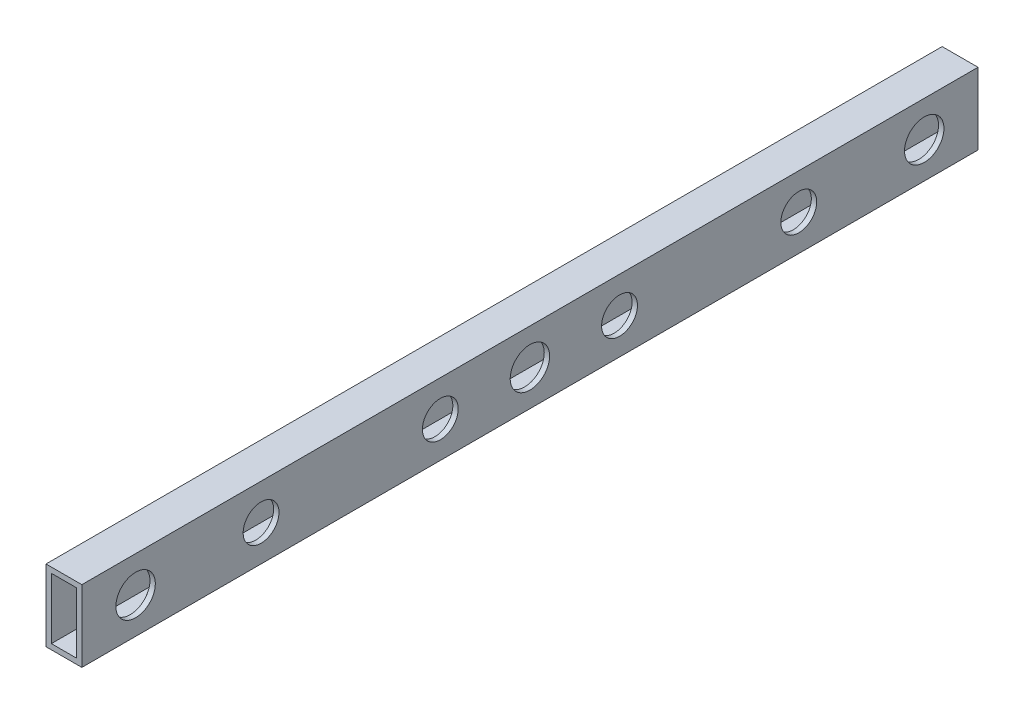
ISO-10303-21;
HEADER;
FILE_DESCRIPTION(('STEP AP214'),'2;1');
FILE_NAME('part.step','',(''),(''),'','','');
FILE_SCHEMA(('AUTOMOTIVE_DESIGN { 1 0 10303 214 1 1 1 1 }'));
ENDSEC;
DATA;
#1=APPLICATION_CONTEXT('core data for automotive mechanical design processes');
#2=APPLICATION_PROTOCOL_DEFINITION('international standard','automotive_design',2000,#1);
#3=PRODUCT_CONTEXT('',#1,'mechanical');
#4=PRODUCT('Part','Part','',(#3));
#5=PRODUCT_RELATED_PRODUCT_CATEGORY('part','',(#4));
#6=PRODUCT_DEFINITION_FORMATION('','',#4);
#7=PRODUCT_DEFINITION_CONTEXT('part definition',#1,'design');
#8=PRODUCT_DEFINITION('design','',#6,#7);
#9=PRODUCT_DEFINITION_SHAPE('','',#8);
#10=(LENGTH_UNIT() NAMED_UNIT(*) SI_UNIT(.MILLI.,.METRE.));
#11=(NAMED_UNIT(*) PLANE_ANGLE_UNIT() SI_UNIT($,.RADIAN.));
#12=(NAMED_UNIT(*) SI_UNIT($,.STERADIAN.) SOLID_ANGLE_UNIT());
#13=UNCERTAINTY_MEASURE_WITH_UNIT(LENGTH_MEASURE(1.E-05),#10,'distance_accuracy_value','');
#14=(GEOMETRIC_REPRESENTATION_CONTEXT(3) GLOBAL_UNCERTAINTY_ASSIGNED_CONTEXT((#13)) GLOBAL_UNIT_ASSIGNED_CONTEXT((#10,
#11,#12)) REPRESENTATION_CONTEXT('',''));
#15=CARTESIAN_POINT('',(0.,0.,0.));
#16=DIRECTION('',(0.,0.,1.));
#17=DIRECTION('',(1.,0.,0.));
#18=AXIS2_PLACEMENT_3D('',#15,#16,#17);
#19=CARTESIAN_POINT('',(0.,0.,250.));
#20=DIRECTION('',(0.,0.,1.));
#21=DIRECTION('',(1.,0.,0.));
#22=AXIS2_PLACEMENT_3D('',#19,#20,#21);
#23=PLANE('',#22);
#24=DIRECTION('',(0.,-1.,0.));
#25=VECTOR('',#24,1.);
#26=CARTESIAN_POINT('',(0.,0.,250.));
#27=LINE('',#26,#25);
#28=CARTESIAN_POINT('',(0.,20.,250.));
#29=VERTEX_POINT('',#28);
#30=CARTESIAN_POINT('',(0.,0.,250.));
#31=VERTEX_POINT('',#30);
#32=EDGE_CURVE('E163',#29,#31,#27,.T.);
#33=ORIENTED_EDGE('',*,*,#32,.T.);
#34=DIRECTION('',(1.,0.,0.));
#35=VECTOR('',#34,1.);
#36=CARTESIAN_POINT('',(0.,0.,250.));
#37=LINE('',#36,#35);
#38=CARTESIAN_POINT('',(10.,0.,250.));
#39=VERTEX_POINT('',#38);
#40=EDGE_CURVE('E166',#31,#39,#37,.T.);
#41=ORIENTED_EDGE('',*,*,#40,.T.);
#42=DIRECTION('',(0.,1.,0.));
#43=VECTOR('',#42,1.);
#44=CARTESIAN_POINT('',(10.,0.,250.));
#45=LINE('',#44,#43);
#46=CARTESIAN_POINT('',(10.,20.,250.));
#47=VERTEX_POINT('',#46);
#48=EDGE_CURVE('E169',#39,#47,#45,.T.);
#49=ORIENTED_EDGE('',*,*,#48,.T.);
#50=DIRECTION('',(-1.,0.,0.));
#51=VECTOR('',#50,1.);
#52=CARTESIAN_POINT('',(0.,20.,250.));
#53=LINE('',#52,#51);
#54=EDGE_CURVE('E171',#47,#29,#53,.T.);
#55=ORIENTED_EDGE('',*,*,#54,.T.);
#56=EDGE_LOOP('',(#33,#41,#49,#55));
#57=FACE_BOUND('',#56,.T.);
#58=DIRECTION('',(1.,0.,0.));
#59=VECTOR('',#58,1.);
#60=CARTESIAN_POINT('',(0.,1.5,250.));
#61=LINE('',#60,#59);
#62=CARTESIAN_POINT('',(1.5,1.5,250.));
#63=VERTEX_POINT('',#62);
#64=CARTESIAN_POINT('',(8.5,1.5,250.));
#65=VERTEX_POINT('',#64);
#66=EDGE_CURVE('E133',#63,#65,#61,.T.);
#67=ORIENTED_EDGE('',*,*,#66,.F.);
#68=DIRECTION('',(0.,-1.,0.));
#69=VECTOR('',#68,1.);
#70=CARTESIAN_POINT('',(1.5,20.,250.));
#71=LINE('',#70,#69);
#72=CARTESIAN_POINT('',(1.5,18.5,250.));
#73=VERTEX_POINT('',#72);
#74=EDGE_CURVE('E125',#73,#63,#71,.T.);
#75=ORIENTED_EDGE('',*,*,#74,.F.);
#76=DIRECTION('',(-1.,0.,0.));
#77=VECTOR('',#76,1.);
#78=CARTESIAN_POINT('',(0.,18.5,250.));
#79=LINE('',#78,#77);
#80=CARTESIAN_POINT('',(8.5,18.5,250.));
#81=VERTEX_POINT('',#80);
#82=EDGE_CURVE('E147',#81,#73,#79,.T.);
#83=ORIENTED_EDGE('',*,*,#82,.F.);
#84=DIRECTION('',(0.,1.,0.));
#85=VECTOR('',#84,1.);
#86=CARTESIAN_POINT('',(8.5,20.,250.));
#87=LINE('',#86,#85);
#88=EDGE_CURVE('E145',#65,#81,#87,.T.);
#89=ORIENTED_EDGE('',*,*,#88,.F.);
#90=EDGE_LOOP('',(#67,#75,#83,#89));
#91=FACE_BOUND('',#90,.T.);
#92=ADVANCED_FACE('F58',(#57,#91),#23,.T.);
#93=CARTESIAN_POINT('',(0.,0.,0.));
#94=DIRECTION('',(0.,0.,1.));
#95=DIRECTION('',(1.,0.,0.));
#96=AXIS2_PLACEMENT_3D('',#93,#94,#95);
#97=PLANE('',#96);
#98=DIRECTION('',(0.,-1.,0.));
#99=VECTOR('',#98,1.);
#100=CARTESIAN_POINT('',(0.,0.,0.));
#101=LINE('',#100,#99);
#102=CARTESIAN_POINT('',(0.,20.,0.));
#103=VERTEX_POINT('',#102);
#104=CARTESIAN_POINT('',(0.,0.,0.));
#105=VERTEX_POINT('',#104);
#106=EDGE_CURVE('E141',#103,#105,#101,.T.);
#107=ORIENTED_EDGE('',*,*,#106,.F.);
#108=DIRECTION('',(-1.,0.,0.));
#109=VECTOR('',#108,1.);
#110=CARTESIAN_POINT('',(0.,20.,0.));
#111=LINE('',#110,#109);
#112=CARTESIAN_POINT('',(10.,20.,0.));
#113=VERTEX_POINT('',#112);
#114=EDGE_CURVE('E167',#113,#103,#111,.T.);
#115=ORIENTED_EDGE('',*,*,#114,.F.);
#116=DIRECTION('',(0.,1.,0.));
#117=VECTOR('',#116,1.);
#118=CARTESIAN_POINT('',(10.,0.,0.));
#119=LINE('',#118,#117);
#120=CARTESIAN_POINT('',(10.,0.,0.));
#121=VERTEX_POINT('',#120);
#122=EDGE_CURVE('E178',#121,#113,#119,.T.);
#123=ORIENTED_EDGE('',*,*,#122,.F.);
#124=DIRECTION('',(1.,0.,0.));
#125=VECTOR('',#124,1.);
#126=CARTESIAN_POINT('',(0.,0.,0.));
#127=LINE('',#126,#125);
#128=EDGE_CURVE('E176',#105,#121,#127,.T.);
#129=ORIENTED_EDGE('',*,*,#128,.F.);
#130=EDGE_LOOP('',(#107,#115,#123,#129));
#131=FACE_BOUND('',#130,.T.);
#132=DIRECTION('',(0.,-1.,0.));
#133=VECTOR('',#132,1.);
#134=CARTESIAN_POINT('',(1.5,20.,0.));
#135=LINE('',#134,#133);
#136=CARTESIAN_POINT('',(1.5,18.5,0.));
#137=VERTEX_POINT('',#136);
#138=CARTESIAN_POINT('',(1.5,1.5,0.));
#139=VERTEX_POINT('',#138);
#140=EDGE_CURVE('E83',#137,#139,#135,.T.);
#141=ORIENTED_EDGE('',*,*,#140,.T.);
#142=DIRECTION('',(1.,0.,0.));
#143=VECTOR('',#142,1.);
#144=CARTESIAN_POINT('',(0.,1.5,0.));
#145=LINE('',#144,#143);
#146=CARTESIAN_POINT('',(8.5,1.5,0.));
#147=VERTEX_POINT('',#146);
#148=EDGE_CURVE('E140',#139,#147,#145,.T.);
#149=ORIENTED_EDGE('',*,*,#148,.T.);
#150=DIRECTION('',(0.,1.,0.));
#151=VECTOR('',#150,1.);
#152=CARTESIAN_POINT('',(8.5,20.,0.));
#153=LINE('',#152,#151);
#154=CARTESIAN_POINT('',(8.5,18.5,0.));
#155=VERTEX_POINT('',#154);
#156=EDGE_CURVE('E155',#147,#155,#153,.T.);
#157=ORIENTED_EDGE('',*,*,#156,.T.);
#158=DIRECTION('',(-1.,0.,0.));
#159=VECTOR('',#158,1.);
#160=CARTESIAN_POINT('',(0.,18.5,0.));
#161=LINE('',#160,#159);
#162=EDGE_CURVE('E134',#155,#137,#161,.T.);
#163=ORIENTED_EDGE('',*,*,#162,.T.);
#164=EDGE_LOOP('',(#141,#149,#157,#163));
#165=FACE_BOUND('',#164,.T.);
#166=ADVANCED_FACE('F287',(#131,#165),#97,.F.);
#167=CARTESIAN_POINT('',(0.,0.,250.));
#168=DIRECTION('',(1.,0.,0.));
#169=DIRECTION('',(0.,0.,-1.));
#170=AXIS2_PLACEMENT_3D('',#167,#168,#169);
#171=PLANE('',#170);
#172=CARTESIAN_POINT('',(0.,10.,50.));
#173=DIRECTION('',(-1.,0.,0.));
#174=DIRECTION('',(0.,0.,1.));
#175=AXIS2_PLACEMENT_3D('',#172,#173,#174);
#176=CIRCLE('',#175,5.00000000000001);
#177=CARTESIAN_POINT('',(0.,10.,55.));
#178=VERTEX_POINT('',#177);
#179=EDGE_CURVE('E416',#178,#178,#176,.T.);
#180=ORIENTED_EDGE('',*,*,#179,.F.);
#181=EDGE_LOOP('',(#180));
#182=FACE_BOUND('',#181,.T.);
#183=CARTESIAN_POINT('',(0.,10.,100.));
#184=DIRECTION('',(-1.,0.,0.));
#185=DIRECTION('',(0.,0.,1.));
#186=AXIS2_PLACEMENT_3D('',#183,#184,#185);
#187=CIRCLE('',#186,5.00000000000001);
#188=CARTESIAN_POINT('',(0.,10.,105.));
#189=VERTEX_POINT('',#188);
#190=EDGE_CURVE('E222',#189,#189,#187,.T.);
#191=ORIENTED_EDGE('',*,*,#190,.F.);
#192=EDGE_LOOP('',(#191));
#193=FACE_BOUND('',#192,.T.);
#194=CARTESIAN_POINT('',(0.,10.,150.));
#195=DIRECTION('',(-1.,0.,0.));
#196=DIRECTION('',(0.,0.,1.));
#197=AXIS2_PLACEMENT_3D('',#194,#195,#196);
#198=CIRCLE('',#197,5.00000000000001);
#199=CARTESIAN_POINT('',(0.,10.,155.));
#200=VERTEX_POINT('',#199);
#201=EDGE_CURVE('E218',#200,#200,#198,.T.);
#202=ORIENTED_EDGE('',*,*,#201,.F.);
#203=EDGE_LOOP('',(#202));
#204=FACE_BOUND('',#203,.T.);
#205=CARTESIAN_POINT('',(0.,10.,200.));
#206=DIRECTION('',(-1.,0.,0.));
#207=DIRECTION('',(0.,0.,1.));
#208=AXIS2_PLACEMENT_3D('',#205,#206,#207);
#209=CIRCLE('',#208,5.00000000000001);
#210=CARTESIAN_POINT('',(0.,10.,205.));
#211=VERTEX_POINT('',#210);
#212=EDGE_CURVE('E214',#211,#211,#209,.T.);
#213=ORIENTED_EDGE('',*,*,#212,.F.);
#214=EDGE_LOOP('',(#213));
#215=FACE_BOUND('',#214,.T.);
#216=CARTESIAN_POINT('',(0.,10.,235.));
#217=DIRECTION('',(1.,0.,0.));
#218=DIRECTION('',(0.,0.,-1.));
#219=AXIS2_PLACEMENT_3D('',#216,#217,#218);
#220=CIRCLE('',#219,3.3);
#221=CARTESIAN_POINT('',(0.,10.,231.7));
#222=VERTEX_POINT('',#221);
#223=EDGE_CURVE('E206',#222,#222,#220,.T.);
#224=ORIENTED_EDGE('',*,*,#223,.T.);
#225=EDGE_LOOP('',(#224));
#226=FACE_BOUND('',#225,.T.);
#227=CARTESIAN_POINT('',(0.,10.,125.));
#228=DIRECTION('',(1.,0.,0.));
#229=DIRECTION('',(0.,0.,-1.));
#230=AXIS2_PLACEMENT_3D('',#227,#228,#229);
#231=CIRCLE('',#230,3.3);
#232=CARTESIAN_POINT('',(0.,10.,121.7));
#233=VERTEX_POINT('',#232);
#234=EDGE_CURVE('E198',#233,#233,#231,.T.);
#235=ORIENTED_EDGE('',*,*,#234,.T.);
#236=EDGE_LOOP('',(#235));
#237=FACE_BOUND('',#236,.T.);
#238=CARTESIAN_POINT('',(0.,10.,15.));
#239=DIRECTION('',(1.,0.,0.));
#240=DIRECTION('',(0.,0.,-1.));
#241=AXIS2_PLACEMENT_3D('',#238,#239,#240);
#242=CIRCLE('',#241,3.3);
#243=CARTESIAN_POINT('',(0.,10.,11.7));
#244=VERTEX_POINT('',#243);
#245=EDGE_CURVE('E191',#244,#244,#242,.T.);
#246=ORIENTED_EDGE('',*,*,#245,.T.);
#247=EDGE_LOOP('',(#246));
#248=FACE_BOUND('',#247,.T.);
#249=ORIENTED_EDGE('',*,*,#106,.T.);
#250=DIRECTION('',(0.,0.,-1.));
#251=VECTOR('',#250,1.);
#252=CARTESIAN_POINT('',(0.,0.,250.));
#253=LINE('',#252,#251);
#254=EDGE_CURVE('E12',#31,#105,#253,.T.);
#255=ORIENTED_EDGE('',*,*,#254,.F.);
#256=ORIENTED_EDGE('',*,*,#32,.F.);
#257=DIRECTION('',(0.,0.,-1.));
#258=VECTOR('',#257,1.);
#259=CARTESIAN_POINT('',(0.,20.,250.));
#260=LINE('',#259,#258);
#261=EDGE_CURVE('E173',#29,#103,#260,.T.);
#262=ORIENTED_EDGE('',*,*,#261,.T.);
#263=EDGE_LOOP('',(#249,#255,#256,#262));
#264=FACE_BOUND('',#263,.T.);
#265=ADVANCED_FACE('F60',(#182,#193,#204,#215,#226,#237,#248,#264),#171,.F.);
#266=CARTESIAN_POINT('',(0.,0.,250.));
#267=DIRECTION('',(0.,1.,0.));
#268=DIRECTION('',(0.,0.,1.));
#269=AXIS2_PLACEMENT_3D('',#266,#267,#268);
#270=PLANE('',#269);
#271=ORIENTED_EDGE('',*,*,#128,.T.);
#272=DIRECTION('',(0.,0.,-1.));
#273=VECTOR('',#272,1.);
#274=CARTESIAN_POINT('',(10.,0.,250.));
#275=LINE('',#274,#273);
#276=EDGE_CURVE('E67',#39,#121,#275,.T.);
#277=ORIENTED_EDGE('',*,*,#276,.F.);
#278=ORIENTED_EDGE('',*,*,#40,.F.);
#279=ORIENTED_EDGE('',*,*,#254,.T.);
#280=EDGE_LOOP('',(#271,#277,#278,#279));
#281=FACE_BOUND('',#280,.T.);
#282=ADVANCED_FACE('F304',(#281),#270,.F.);
#283=CARTESIAN_POINT('',(10.,0.,250.));
#284=DIRECTION('',(-1.,0.,0.));
#285=DIRECTION('',(0.,0.,1.));
#286=AXIS2_PLACEMENT_3D('',#283,#284,#285);
#287=PLANE('',#286);
#288=CARTESIAN_POINT('',(10.,10.,50.));
#289=DIRECTION('',(-1.,0.,0.));
#290=DIRECTION('',(0.,0.,1.));
#291=AXIS2_PLACEMENT_3D('',#288,#289,#290);
#292=CIRCLE('',#291,5.00000000000001);
#293=CARTESIAN_POINT('',(10.,10.,55.));
#294=VERTEX_POINT('',#293);
#295=EDGE_CURVE('E229',#294,#294,#292,.T.);
#296=ORIENTED_EDGE('',*,*,#295,.T.);
#297=EDGE_LOOP('',(#296));
#298=FACE_BOUND('',#297,.T.);
#299=CARTESIAN_POINT('',(10.,10.,100.));
#300=DIRECTION('',(-1.,0.,0.));
#301=DIRECTION('',(0.,0.,1.));
#302=AXIS2_PLACEMENT_3D('',#299,#300,#301);
#303=CIRCLE('',#302,5.00000000000001);
#304=CARTESIAN_POINT('',(10.,10.,105.));
#305=VERTEX_POINT('',#304);
#306=EDGE_CURVE('E226',#305,#305,#303,.T.);
#307=ORIENTED_EDGE('',*,*,#306,.T.);
#308=EDGE_LOOP('',(#307));
#309=FACE_BOUND('',#308,.T.);
#310=CARTESIAN_POINT('',(10.,10.,150.));
#311=DIRECTION('',(-1.,0.,0.));
#312=DIRECTION('',(0.,0.,1.));
#313=AXIS2_PLACEMENT_3D('',#310,#311,#312);
#314=CIRCLE('',#313,5.00000000000001);
#315=CARTESIAN_POINT('',(10.,10.,155.));
#316=VERTEX_POINT('',#315);
#317=EDGE_CURVE('E244',#316,#316,#314,.T.);
#318=ORIENTED_EDGE('',*,*,#317,.T.);
#319=EDGE_LOOP('',(#318));
#320=FACE_BOUND('',#319,.T.);
#321=CARTESIAN_POINT('',(10.,10.,200.));
#322=DIRECTION('',(-1.,0.,0.));
#323=DIRECTION('',(0.,0.,1.));
#324=AXIS2_PLACEMENT_3D('',#321,#322,#323);
#325=CIRCLE('',#324,5.00000000000001);
#326=CARTESIAN_POINT('',(10.,10.,205.));
#327=VERTEX_POINT('',#326);
#328=EDGE_CURVE('E251',#327,#327,#325,.T.);
#329=ORIENTED_EDGE('',*,*,#328,.T.);
#330=EDGE_LOOP('',(#329));
#331=FACE_BOUND('',#330,.T.);
#332=CARTESIAN_POINT('',(10.,10.,235.));
#333=DIRECTION('',(1.,0.,0.));
#334=DIRECTION('',(0.,0.,-1.));
#335=AXIS2_PLACEMENT_3D('',#332,#333,#334);
#336=CIRCLE('',#335,5.5);
#337=CARTESIAN_POINT('',(10.,10.,229.5));
#338=VERTEX_POINT('',#337);
#339=EDGE_CURVE('E254',#338,#338,#336,.T.);
#340=ORIENTED_EDGE('',*,*,#339,.F.);
#341=EDGE_LOOP('',(#340));
#342=FACE_BOUND('',#341,.T.);
#343=CARTESIAN_POINT('',(10.,10.,125.));
#344=DIRECTION('',(1.,0.,0.));
#345=DIRECTION('',(0.,0.,-1.));
#346=AXIS2_PLACEMENT_3D('',#343,#344,#345);
#347=CIRCLE('',#346,5.5);
#348=CARTESIAN_POINT('',(10.,10.,119.5));
#349=VERTEX_POINT('',#348);
#350=EDGE_CURVE('E209',#349,#349,#347,.T.);
#351=ORIENTED_EDGE('',*,*,#350,.F.);
#352=EDGE_LOOP('',(#351));
#353=FACE_BOUND('',#352,.T.);
#354=CARTESIAN_POINT('',(10.,10.,15.));
#355=DIRECTION('',(1.,0.,0.));
#356=DIRECTION('',(0.,0.,-1.));
#357=AXIS2_PLACEMENT_3D('',#354,#355,#356);
#358=CIRCLE('',#357,5.5);
#359=CARTESIAN_POINT('',(10.,10.,9.49999999999999));
#360=VERTEX_POINT('',#359);
#361=EDGE_CURVE('E201',#360,#360,#358,.T.);
#362=ORIENTED_EDGE('',*,*,#361,.F.);
#363=EDGE_LOOP('',(#362));
#364=FACE_BOUND('',#363,.T.);
#365=ORIENTED_EDGE('',*,*,#122,.T.);
#366=DIRECTION('',(0.,0.,-1.));
#367=VECTOR('',#366,1.);
#368=CARTESIAN_POINT('',(10.,20.,250.));
#369=LINE('',#368,#367);
#370=EDGE_CURVE('E183',#47,#113,#369,.T.);
#371=ORIENTED_EDGE('',*,*,#370,.F.);
#372=ORIENTED_EDGE('',*,*,#48,.F.);
#373=ORIENTED_EDGE('',*,*,#276,.T.);
#374=EDGE_LOOP('',(#365,#371,#372,#373));
#375=FACE_BOUND('',#374,.T.);
#376=ADVANCED_FACE('F301',(#298,#309,#320,#331,#342,#353,#364,#375),#287,.F.);
#377=CARTESIAN_POINT('',(0.,20.,250.));
#378=DIRECTION('',(0.,-1.,0.));
#379=DIRECTION('',(1.,0.,0.));
#380=AXIS2_PLACEMENT_3D('',#377,#378,#379);
#381=PLANE('',#380);
#382=ORIENTED_EDGE('',*,*,#114,.T.);
#383=ORIENTED_EDGE('',*,*,#261,.F.);
#384=ORIENTED_EDGE('',*,*,#54,.F.);
#385=ORIENTED_EDGE('',*,*,#370,.T.);
#386=EDGE_LOOP('',(#382,#383,#384,#385));
#387=FACE_BOUND('',#386,.T.);
#388=ADVANCED_FACE('F298',(#387),#381,.F.);
#389=CARTESIAN_POINT('',(1.5,20.,250.));
#390=DIRECTION('',(1.,0.,0.));
#391=DIRECTION('',(0.,0.,-1.));
#392=AXIS2_PLACEMENT_3D('',#389,#390,#391);
#393=PLANE('',#392);
#394=CARTESIAN_POINT('',(1.5,10.,50.));
#395=DIRECTION('',(1.,0.,0.));
#396=DIRECTION('',(0.,0.,-1.));
#397=AXIS2_PLACEMENT_3D('',#394,#395,#396);
#398=CIRCLE('',#397,5.00000000000001);
#399=CARTESIAN_POINT('',(1.5,10.,45.));
#400=VERTEX_POINT('',#399);
#401=EDGE_CURVE('E234',#400,#400,#398,.T.);
#402=ORIENTED_EDGE('',*,*,#401,.F.);
#403=EDGE_LOOP('',(#402));
#404=FACE_BOUND('',#403,.T.);
#405=CARTESIAN_POINT('',(1.5,10.,100.));
#406=DIRECTION('',(1.,0.,0.));
#407=DIRECTION('',(0.,0.,-1.));
#408=AXIS2_PLACEMENT_3D('',#405,#406,#407);
#409=CIRCLE('',#408,5.00000000000001);
#410=CARTESIAN_POINT('',(1.5,10.,95.));
#411=VERTEX_POINT('',#410);
#412=EDGE_CURVE('E221',#411,#411,#409,.T.);
#413=ORIENTED_EDGE('',*,*,#412,.F.);
#414=EDGE_LOOP('',(#413));
#415=FACE_BOUND('',#414,.T.);
#416=CARTESIAN_POINT('',(1.5,10.,150.));
#417=DIRECTION('',(1.,0.,0.));
#418=DIRECTION('',(0.,0.,-1.));
#419=AXIS2_PLACEMENT_3D('',#416,#417,#418);
#420=CIRCLE('',#419,5.00000000000001);
#421=CARTESIAN_POINT('',(1.5,10.,145.));
#422=VERTEX_POINT('',#421);
#423=EDGE_CURVE('E217',#422,#422,#420,.T.);
#424=ORIENTED_EDGE('',*,*,#423,.F.);
#425=EDGE_LOOP('',(#424));
#426=FACE_BOUND('',#425,.T.);
#427=CARTESIAN_POINT('',(1.5,10.,200.));
#428=DIRECTION('',(1.,0.,0.));
#429=DIRECTION('',(0.,0.,-1.));
#430=AXIS2_PLACEMENT_3D('',#427,#428,#429);
#431=CIRCLE('',#430,5.00000000000001);
#432=CARTESIAN_POINT('',(1.5,10.,195.));
#433=VERTEX_POINT('',#432);
#434=EDGE_CURVE('E213',#433,#433,#431,.T.);
#435=ORIENTED_EDGE('',*,*,#434,.F.);
#436=EDGE_LOOP('',(#435));
#437=FACE_BOUND('',#436,.T.);
#438=CARTESIAN_POINT('',(1.5,10.,235.));
#439=DIRECTION('',(1.,0.,0.));
#440=DIRECTION('',(0.,0.,-1.));
#441=AXIS2_PLACEMENT_3D('',#438,#439,#440);
#442=CIRCLE('',#441,3.3);
#443=CARTESIAN_POINT('',(1.5,10.,231.7));
#444=VERTEX_POINT('',#443);
#445=EDGE_CURVE('E205',#444,#444,#442,.T.);
#446=ORIENTED_EDGE('',*,*,#445,.F.);
#447=EDGE_LOOP('',(#446));
#448=FACE_BOUND('',#447,.T.);
#449=CARTESIAN_POINT('',(1.5,10.,125.));
#450=DIRECTION('',(1.,0.,0.));
#451=DIRECTION('',(0.,0.,-1.));
#452=AXIS2_PLACEMENT_3D('',#449,#450,#451);
#453=CIRCLE('',#452,3.3);
#454=CARTESIAN_POINT('',(1.5,10.,121.7));
#455=VERTEX_POINT('',#454);
#456=EDGE_CURVE('E197',#455,#455,#453,.T.);
#457=ORIENTED_EDGE('',*,*,#456,.F.);
#458=EDGE_LOOP('',(#457));
#459=FACE_BOUND('',#458,.T.);
#460=CARTESIAN_POINT('',(1.5,10.,15.));
#461=DIRECTION('',(1.,0.,0.));
#462=DIRECTION('',(0.,0.,-1.));
#463=AXIS2_PLACEMENT_3D('',#460,#461,#462);
#464=CIRCLE('',#463,3.3);
#465=CARTESIAN_POINT('',(1.5,10.,11.7));
#466=VERTEX_POINT('',#465);
#467=EDGE_CURVE('E153',#466,#466,#464,.T.);
#468=ORIENTED_EDGE('',*,*,#467,.F.);
#469=EDGE_LOOP('',(#468));
#470=FACE_BOUND('',#469,.T.);
#471=ORIENTED_EDGE('',*,*,#140,.F.);
#472=DIRECTION('',(0.,0.,-1.));
#473=VECTOR('',#472,1.);
#474=CARTESIAN_POINT('',(1.5,18.5,250.));
#475=LINE('',#474,#473);
#476=EDGE_CURVE('E129',#73,#137,#475,.T.);
#477=ORIENTED_EDGE('',*,*,#476,.F.);
#478=ORIENTED_EDGE('',*,*,#74,.T.);
#479=DIRECTION('',(0.,0.,-1.));
#480=VECTOR('',#479,1.);
#481=CARTESIAN_POINT('',(1.5,1.5,250.));
#482=LINE('',#481,#480);
#483=EDGE_CURVE('E128',#63,#139,#482,.T.);
#484=ORIENTED_EDGE('',*,*,#483,.T.);
#485=EDGE_LOOP('',(#471,#477,#478,#484));
#486=FACE_BOUND('',#485,.T.);
#487=ADVANCED_FACE('F127',(#404,#415,#426,#437,#448,#459,#470,#486),#393,.T.);
#488=CARTESIAN_POINT('',(0.,1.5,250.));
#489=DIRECTION('',(0.,1.,0.));
#490=DIRECTION('',(0.,0.,1.));
#491=AXIS2_PLACEMENT_3D('',#488,#489,#490);
#492=PLANE('',#491);
#493=ORIENTED_EDGE('',*,*,#148,.F.);
#494=ORIENTED_EDGE('',*,*,#483,.F.);
#495=ORIENTED_EDGE('',*,*,#66,.T.);
#496=DIRECTION('',(0.,0.,-1.));
#497=VECTOR('',#496,1.);
#498=CARTESIAN_POINT('',(8.5,1.5,250.));
#499=LINE('',#498,#497);
#500=EDGE_CURVE('E142',#65,#147,#499,.T.);
#501=ORIENTED_EDGE('',*,*,#500,.T.);
#502=EDGE_LOOP('',(#493,#494,#495,#501));
#503=FACE_BOUND('',#502,.T.);
#504=ADVANCED_FACE('F137',(#503),#492,.T.);
#505=CARTESIAN_POINT('',(8.5,20.,250.));
#506=DIRECTION('',(-1.,0.,0.));
#507=DIRECTION('',(0.,0.,1.));
#508=AXIS2_PLACEMENT_3D('',#505,#506,#507);
#509=PLANE('',#508);
#510=CARTESIAN_POINT('',(8.5,10.,50.));
#511=DIRECTION('',(-1.,0.,0.));
#512=DIRECTION('',(0.,0.,1.));
#513=AXIS2_PLACEMENT_3D('',#510,#511,#512);
#514=CIRCLE('',#513,5.00000000000001);
#515=CARTESIAN_POINT('',(8.5,10.,55.));
#516=VERTEX_POINT('',#515);
#517=EDGE_CURVE('E62',#516,#516,#514,.T.);
#518=ORIENTED_EDGE('',*,*,#517,.F.);
#519=EDGE_LOOP('',(#518));
#520=FACE_BOUND('',#519,.T.);
#521=CARTESIAN_POINT('',(8.5,10.,100.));
#522=DIRECTION('',(-1.,0.,0.));
#523=DIRECTION('',(0.,0.,1.));
#524=AXIS2_PLACEMENT_3D('',#521,#522,#523);
#525=CIRCLE('',#524,5.00000000000001);
#526=CARTESIAN_POINT('',(8.5,10.,105.));
#527=VERTEX_POINT('',#526);
#528=EDGE_CURVE('E219',#527,#527,#525,.T.);
#529=ORIENTED_EDGE('',*,*,#528,.F.);
#530=EDGE_LOOP('',(#529));
#531=FACE_BOUND('',#530,.T.);
#532=CARTESIAN_POINT('',(8.5,10.,150.));
#533=DIRECTION('',(-1.,0.,0.));
#534=DIRECTION('',(0.,0.,1.));
#535=AXIS2_PLACEMENT_3D('',#532,#533,#534);
#536=CIRCLE('',#535,5.00000000000001);
#537=CARTESIAN_POINT('',(8.5,10.,155.));
#538=VERTEX_POINT('',#537);
#539=EDGE_CURVE('E215',#538,#538,#536,.T.);
#540=ORIENTED_EDGE('',*,*,#539,.F.);
#541=EDGE_LOOP('',(#540));
#542=FACE_BOUND('',#541,.T.);
#543=CARTESIAN_POINT('',(8.5,10.,200.));
#544=DIRECTION('',(-1.,0.,0.));
#545=DIRECTION('',(0.,0.,1.));
#546=AXIS2_PLACEMENT_3D('',#543,#544,#545);
#547=CIRCLE('',#546,5.00000000000001);
#548=CARTESIAN_POINT('',(8.5,10.,205.));
#549=VERTEX_POINT('',#548);
#550=EDGE_CURVE('E210',#549,#549,#547,.T.);
#551=ORIENTED_EDGE('',*,*,#550,.F.);
#552=EDGE_LOOP('',(#551));
#553=FACE_BOUND('',#552,.T.);
#554=CARTESIAN_POINT('',(8.5,10.,235.));
#555=DIRECTION('',(-1.,0.,0.));
#556=DIRECTION('',(0.,0.,1.));
#557=AXIS2_PLACEMENT_3D('',#554,#555,#556);
#558=CIRCLE('',#557,5.5);
#559=CARTESIAN_POINT('',(8.5,10.,240.5));
#560=VERTEX_POINT('',#559);
#561=EDGE_CURVE('E202',#560,#560,#558,.T.);
#562=ORIENTED_EDGE('',*,*,#561,.F.);
#563=EDGE_LOOP('',(#562));
#564=FACE_BOUND('',#563,.T.);
#565=CARTESIAN_POINT('',(8.5,10.,125.));
#566=DIRECTION('',(-1.,0.,0.));
#567=DIRECTION('',(0.,0.,1.));
#568=AXIS2_PLACEMENT_3D('',#565,#566,#567);
#569=CIRCLE('',#568,5.5);
#570=CARTESIAN_POINT('',(8.5,10.,130.5));
#571=VERTEX_POINT('',#570);
#572=EDGE_CURVE('E194',#571,#571,#569,.T.);
#573=ORIENTED_EDGE('',*,*,#572,.F.);
#574=EDGE_LOOP('',(#573));
#575=FACE_BOUND('',#574,.T.);
#576=CARTESIAN_POINT('',(8.5,10.,15.));
#577=DIRECTION('',(-1.,0.,0.));
#578=DIRECTION('',(0.,0.,1.));
#579=AXIS2_PLACEMENT_3D('',#576,#577,#578);
#580=CIRCLE('',#579,5.5);
#581=CARTESIAN_POINT('',(8.5,10.,20.5));
#582=VERTEX_POINT('',#581);
#583=EDGE_CURVE('E188',#582,#582,#580,.T.);
#584=ORIENTED_EDGE('',*,*,#583,.F.);
#585=EDGE_LOOP('',(#584));
#586=FACE_BOUND('',#585,.T.);
#587=ORIENTED_EDGE('',*,*,#156,.F.);
#588=ORIENTED_EDGE('',*,*,#500,.F.);
#589=ORIENTED_EDGE('',*,*,#88,.T.);
#590=DIRECTION('',(0.,0.,-1.));
#591=VECTOR('',#590,1.);
#592=CARTESIAN_POINT('',(8.5,18.5,250.));
#593=LINE('',#592,#591);
#594=EDGE_CURVE('E75',#81,#155,#593,.T.);
#595=ORIENTED_EDGE('',*,*,#594,.T.);
#596=EDGE_LOOP('',(#587,#588,#589,#595));
#597=FACE_BOUND('',#596,.T.);
#598=ADVANCED_FACE('F326',(#520,#531,#542,#553,#564,#575,#586,#597),#509,.T.);
#599=CARTESIAN_POINT('',(0.,18.5,250.));
#600=DIRECTION('',(0.,-1.,0.));
#601=DIRECTION('',(1.,0.,0.));
#602=AXIS2_PLACEMENT_3D('',#599,#600,#601);
#603=PLANE('',#602);
#604=ORIENTED_EDGE('',*,*,#162,.F.);
#605=ORIENTED_EDGE('',*,*,#594,.F.);
#606=ORIENTED_EDGE('',*,*,#82,.T.);
#607=ORIENTED_EDGE('',*,*,#476,.T.);
#608=EDGE_LOOP('',(#604,#605,#606,#607));
#609=FACE_BOUND('',#608,.T.);
#610=ADVANCED_FACE('F282',(#609),#603,.T.);
#611=CARTESIAN_POINT('',(10.,10.,15.));
#612=DIRECTION('',(1.,0.,0.));
#613=DIRECTION('',(0.,0.,-1.));
#614=AXIS2_PLACEMENT_3D('',#611,#612,#613);
#615=CYLINDRICAL_SURFACE('',#614,5.5);
#616=ORIENTED_EDGE('',*,*,#583,.T.);
#617=EDGE_LOOP('',(#616));
#618=FACE_BOUND('',#617,.T.);
#619=ORIENTED_EDGE('',*,*,#361,.T.);
#620=EDGE_LOOP('',(#619));
#621=FACE_BOUND('',#620,.T.);
#622=ADVANCED_FACE('F272',(#618,#621),#615,.F.);
#623=CARTESIAN_POINT('',(10.,10.,15.));
#624=DIRECTION('',(1.,0.,0.));
#625=DIRECTION('',(0.,0.,-1.));
#626=AXIS2_PLACEMENT_3D('',#623,#624,#625);
#627=CYLINDRICAL_SURFACE('',#626,3.3);
#628=ORIENTED_EDGE('',*,*,#467,.T.);
#629=EDGE_LOOP('',(#628));
#630=FACE_BOUND('',#629,.T.);
#631=ORIENTED_EDGE('',*,*,#245,.F.);
#632=EDGE_LOOP('',(#631));
#633=FACE_BOUND('',#632,.T.);
#634=ADVANCED_FACE('F269',(#630,#633),#627,.F.);
#635=CARTESIAN_POINT('',(10.,10.,125.));
#636=DIRECTION('',(1.,0.,0.));
#637=DIRECTION('',(0.,0.,-1.));
#638=AXIS2_PLACEMENT_3D('',#635,#636,#637);
#639=CYLINDRICAL_SURFACE('',#638,5.5);
#640=ORIENTED_EDGE('',*,*,#572,.T.);
#641=EDGE_LOOP('',(#640));
#642=FACE_BOUND('',#641,.T.);
#643=ORIENTED_EDGE('',*,*,#350,.T.);
#644=EDGE_LOOP('',(#643));
#645=FACE_BOUND('',#644,.T.);
#646=ADVANCED_FACE('F271',(#642,#645),#639,.F.);
#647=CARTESIAN_POINT('',(10.,10.,125.));
#648=DIRECTION('',(1.,0.,0.));
#649=DIRECTION('',(0.,0.,-1.));
#650=AXIS2_PLACEMENT_3D('',#647,#648,#649);
#651=CYLINDRICAL_SURFACE('',#650,3.3);
#652=ORIENTED_EDGE('',*,*,#456,.T.);
#653=EDGE_LOOP('',(#652));
#654=FACE_BOUND('',#653,.T.);
#655=ORIENTED_EDGE('',*,*,#234,.F.);
#656=EDGE_LOOP('',(#655));
#657=FACE_BOUND('',#656,.T.);
#658=ADVANCED_FACE('F279',(#654,#657),#651,.F.);
#659=CARTESIAN_POINT('',(10.,10.,235.));
#660=DIRECTION('',(1.,0.,0.));
#661=DIRECTION('',(0.,0.,-1.));
#662=AXIS2_PLACEMENT_3D('',#659,#660,#661);
#663=CYLINDRICAL_SURFACE('',#662,5.5);
#664=ORIENTED_EDGE('',*,*,#561,.T.);
#665=EDGE_LOOP('',(#664));
#666=FACE_BOUND('',#665,.T.);
#667=ORIENTED_EDGE('',*,*,#339,.T.);
#668=EDGE_LOOP('',(#667));
#669=FACE_BOUND('',#668,.T.);
#670=ADVANCED_FACE('F356',(#666,#669),#663,.F.);
#671=CARTESIAN_POINT('',(10.,10.,235.));
#672=DIRECTION('',(1.,0.,0.));
#673=DIRECTION('',(0.,0.,-1.));
#674=AXIS2_PLACEMENT_3D('',#671,#672,#673);
#675=CYLINDRICAL_SURFACE('',#674,3.3);
#676=ORIENTED_EDGE('',*,*,#445,.T.);
#677=EDGE_LOOP('',(#676));
#678=FACE_BOUND('',#677,.T.);
#679=ORIENTED_EDGE('',*,*,#223,.F.);
#680=EDGE_LOOP('',(#679));
#681=FACE_BOUND('',#680,.T.);
#682=ADVANCED_FACE('F363',(#678,#681),#675,.F.);
#683=CARTESIAN_POINT('',(0.,10.,200.));
#684=DIRECTION('',(-1.,0.,0.));
#685=DIRECTION('',(0.,0.,1.));
#686=AXIS2_PLACEMENT_3D('',#683,#684,#685);
#687=CYLINDRICAL_SURFACE('',#686,5.00000000000001);
#688=ORIENTED_EDGE('',*,*,#550,.T.);
#689=EDGE_LOOP('',(#688));
#690=FACE_BOUND('',#689,.T.);
#691=ORIENTED_EDGE('',*,*,#328,.F.);
#692=EDGE_LOOP('',(#691));
#693=FACE_BOUND('',#692,.T.);
#694=ADVANCED_FACE('F368',(#690,#693),#687,.F.);
#695=ORIENTED_EDGE('',*,*,#434,.T.);
#696=EDGE_LOOP('',(#695));
#697=FACE_BOUND('',#696,.T.);
#698=ORIENTED_EDGE('',*,*,#212,.T.);
#699=EDGE_LOOP('',(#698));
#700=FACE_BOUND('',#699,.T.);
#701=ADVANCED_FACE('F373',(#697,#700),#687,.F.);
#702=CARTESIAN_POINT('',(0.,10.,150.));
#703=DIRECTION('',(-1.,0.,0.));
#704=DIRECTION('',(0.,0.,1.));
#705=AXIS2_PLACEMENT_3D('',#702,#703,#704);
#706=CYLINDRICAL_SURFACE('',#705,5.00000000000001);
#707=ORIENTED_EDGE('',*,*,#539,.T.);
#708=EDGE_LOOP('',(#707));
#709=FACE_BOUND('',#708,.T.);
#710=ORIENTED_EDGE('',*,*,#317,.F.);
#711=EDGE_LOOP('',(#710));
#712=FACE_BOUND('',#711,.T.);
#713=ADVANCED_FACE('F375',(#709,#712),#706,.F.);
#714=ORIENTED_EDGE('',*,*,#423,.T.);
#715=EDGE_LOOP('',(#714));
#716=FACE_BOUND('',#715,.T.);
#717=ORIENTED_EDGE('',*,*,#201,.T.);
#718=EDGE_LOOP('',(#717));
#719=FACE_BOUND('',#718,.T.);
#720=ADVANCED_FACE('F378',(#716,#719),#706,.F.);
#721=CARTESIAN_POINT('',(0.,10.,100.));
#722=DIRECTION('',(-1.,0.,0.));
#723=DIRECTION('',(0.,0.,1.));
#724=AXIS2_PLACEMENT_3D('',#721,#722,#723);
#725=CYLINDRICAL_SURFACE('',#724,5.00000000000001);
#726=ORIENTED_EDGE('',*,*,#528,.T.);
#727=EDGE_LOOP('',(#726));
#728=FACE_BOUND('',#727,.T.);
#729=ORIENTED_EDGE('',*,*,#306,.F.);
#730=EDGE_LOOP('',(#729));
#731=FACE_BOUND('',#730,.T.);
#732=ADVANCED_FACE('F380',(#728,#731),#725,.F.);
#733=ORIENTED_EDGE('',*,*,#412,.T.);
#734=EDGE_LOOP('',(#733));
#735=FACE_BOUND('',#734,.T.);
#736=ORIENTED_EDGE('',*,*,#190,.T.);
#737=EDGE_LOOP('',(#736));
#738=FACE_BOUND('',#737,.T.);
#739=ADVANCED_FACE('F383',(#735,#738),#725,.F.);
#740=CARTESIAN_POINT('',(0.,10.,50.));
#741=DIRECTION('',(-1.,0.,0.));
#742=DIRECTION('',(0.,0.,1.));
#743=AXIS2_PLACEMENT_3D('',#740,#741,#742);
#744=CYLINDRICAL_SURFACE('',#743,5.00000000000001);
#745=ORIENTED_EDGE('',*,*,#517,.T.);
#746=EDGE_LOOP('',(#745));
#747=FACE_BOUND('',#746,.T.);
#748=ORIENTED_EDGE('',*,*,#295,.F.);
#749=EDGE_LOOP('',(#748));
#750=FACE_BOUND('',#749,.T.);
#751=ADVANCED_FACE('F384',(#747,#750),#744,.F.);
#752=ORIENTED_EDGE('',*,*,#401,.T.);
#753=EDGE_LOOP('',(#752));
#754=FACE_BOUND('',#753,.T.);
#755=ORIENTED_EDGE('',*,*,#179,.T.);
#756=EDGE_LOOP('',(#755));
#757=FACE_BOUND('',#756,.T.);
#758=ADVANCED_FACE('F386',(#754,#757),#744,.F.);
#759=CLOSED_SHELL('',(#92,#166,#265,#282,#376,#388,#487,#504,#598,#610,#622,#634,#646,#658,#670,
#682,#694,#701,#713,#720,#732,#739,#751,#758));
#760=MANIFOLD_SOLID_BREP('B2',#759);
#761=ADVANCED_BREP_SHAPE_REPRESENTATION('',(#18,#760),#14);
#762=SHAPE_DEFINITION_REPRESENTATION(#9,#761);
ENDSEC;
END-ISO-10303-21;
